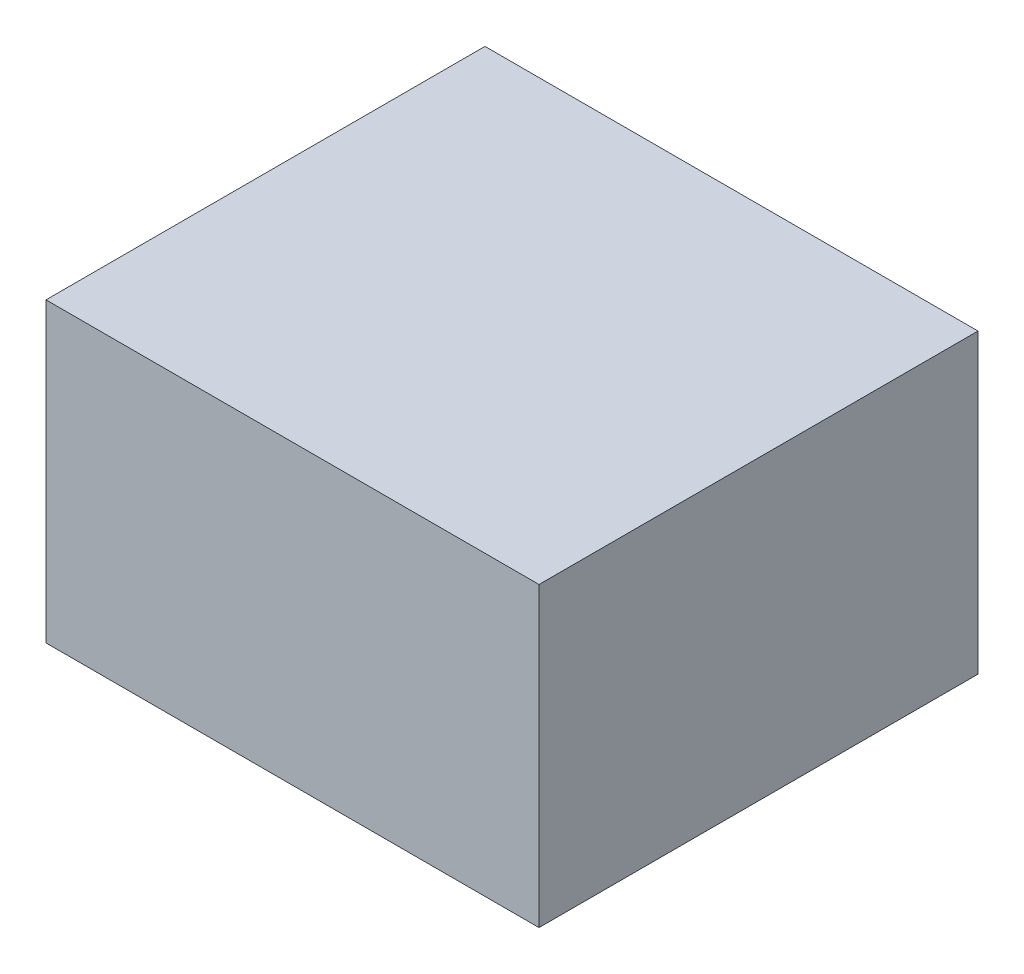
ISO-10303-21;
HEADER;
FILE_DESCRIPTION(('STEP AP214'),'2;1');
FILE_NAME('part.step','',(''),(''),'','','');
FILE_SCHEMA(('AUTOMOTIVE_DESIGN { 1 0 10303 214 1 1 1 1 }'));
ENDSEC;
DATA;
#1=APPLICATION_CONTEXT('core data for automotive mechanical design processes');
#2=APPLICATION_PROTOCOL_DEFINITION('international standard','automotive_design',2000,#1);
#3=PRODUCT_CONTEXT('',#1,'mechanical');
#4=PRODUCT('Part','Part','',(#3));
#5=PRODUCT_RELATED_PRODUCT_CATEGORY('part','',(#4));
#6=PRODUCT_DEFINITION_FORMATION('','',#4);
#7=PRODUCT_DEFINITION_CONTEXT('part definition',#1,'design');
#8=PRODUCT_DEFINITION('design','',#6,#7);
#9=PRODUCT_DEFINITION_SHAPE('','',#8);
#10=(LENGTH_UNIT() NAMED_UNIT(*) SI_UNIT(.MILLI.,.METRE.));
#11=(NAMED_UNIT(*) PLANE_ANGLE_UNIT() SI_UNIT($,.RADIAN.));
#12=(NAMED_UNIT(*) SI_UNIT($,.STERADIAN.) SOLID_ANGLE_UNIT());
#13=UNCERTAINTY_MEASURE_WITH_UNIT(LENGTH_MEASURE(1.E-05),#10,'distance_accuracy_value','');
#14=(GEOMETRIC_REPRESENTATION_CONTEXT(3) GLOBAL_UNCERTAINTY_ASSIGNED_CONTEXT((#13)) GLOBAL_UNIT_ASSIGNED_CONTEXT((#10,
#11,#12)) REPRESENTATION_CONTEXT('',''));
#15=CARTESIAN_POINT('',(0.,0.,0.));
#16=DIRECTION('',(0.,0.,1.));
#17=DIRECTION('',(1.,0.,0.));
#18=AXIS2_PLACEMENT_3D('',#15,#16,#17);
#19=CARTESIAN_POINT('',(36.5,44.,-32.5));
#20=DIRECTION('',(-1.,0.,0.));
#21=DIRECTION('',(0.,0.,1.));
#22=AXIS2_PLACEMENT_3D('',#19,#20,#21);
#23=PLANE('',#22);
#24=DIRECTION('',(0.,0.,-1.));
#25=VECTOR('',#24,1.);
#26=CARTESIAN_POINT('',(36.5,0.,-32.5));
#27=LINE('',#26,#25);
#28=CARTESIAN_POINT('',(36.5,0.,32.5));
#29=VERTEX_POINT('',#28);
#30=CARTESIAN_POINT('',(36.5,0.,-32.5));
#31=VERTEX_POINT('',#30);
#32=EDGE_CURVE('E104',#29,#31,#27,.T.);
#33=ORIENTED_EDGE('',*,*,#32,.T.);
#34=DIRECTION('',(0.,-1.,0.));
#35=VECTOR('',#34,1.);
#36=CARTESIAN_POINT('',(36.5,44.,-32.5));
#37=LINE('',#36,#35);
#38=CARTESIAN_POINT('',(36.5,44.,-32.5));
#39=VERTEX_POINT('',#38);
#40=EDGE_CURVE('E11',#39,#31,#37,.T.);
#41=ORIENTED_EDGE('',*,*,#40,.F.);
#42=DIRECTION('',(0.,0.,-1.));
#43=VECTOR('',#42,1.);
#44=CARTESIAN_POINT('',(36.5,44.,-32.5));
#45=LINE('',#44,#43);
#46=CARTESIAN_POINT('',(36.5,44.,32.5));
#47=VERTEX_POINT('',#46);
#48=EDGE_CURVE('E92',#47,#39,#45,.T.);
#49=ORIENTED_EDGE('',*,*,#48,.F.);
#50=DIRECTION('',(0.,-1.,0.));
#51=VECTOR('',#50,1.);
#52=CARTESIAN_POINT('',(36.5,44.,32.5));
#53=LINE('',#52,#51);
#54=EDGE_CURVE('E100',#47,#29,#53,.T.);
#55=ORIENTED_EDGE('',*,*,#54,.T.);
#56=EDGE_LOOP('',(#33,#41,#49,#55));
#57=FACE_BOUND('',#56,.T.);
#58=ADVANCED_FACE('F41',(#57),#23,.F.);
#59=CARTESIAN_POINT('',(-36.5,44.,-32.5));
#60=DIRECTION('',(0.,0.,1.));
#61=DIRECTION('',(1.,0.,0.));
#62=AXIS2_PLACEMENT_3D('',#59,#60,#61);
#63=PLANE('',#62);
#64=DIRECTION('',(-1.,0.,0.));
#65=VECTOR('',#64,1.);
#66=CARTESIAN_POINT('',(-36.5,0.,-32.5));
#67=LINE('',#66,#65);
#68=CARTESIAN_POINT('',(-36.5,0.,-32.5));
#69=VERTEX_POINT('',#68);
#70=EDGE_CURVE('E96',#31,#69,#67,.T.);
#71=ORIENTED_EDGE('',*,*,#70,.T.);
#72=DIRECTION('',(0.,-1.,0.));
#73=VECTOR('',#72,1.);
#74=CARTESIAN_POINT('',(-36.5,44.,-32.5));
#75=LINE('',#74,#73);
#76=CARTESIAN_POINT('',(-36.5,44.,-32.5));
#77=VERTEX_POINT('',#76);
#78=EDGE_CURVE('E49',#77,#69,#75,.T.);
#79=ORIENTED_EDGE('',*,*,#78,.F.);
#80=DIRECTION('',(-1.,0.,0.));
#81=VECTOR('',#80,1.);
#82=CARTESIAN_POINT('',(-36.5,44.,-32.5));
#83=LINE('',#82,#81);
#84=EDGE_CURVE('E87',#39,#77,#83,.T.);
#85=ORIENTED_EDGE('',*,*,#84,.F.);
#86=ORIENTED_EDGE('',*,*,#40,.T.);
#87=EDGE_LOOP('',(#71,#79,#85,#86));
#88=FACE_BOUND('',#87,.T.);
#89=ADVANCED_FACE('F95',(#88),#63,.F.);
#90=CARTESIAN_POINT('',(-36.5,44.,-32.5));
#91=DIRECTION('',(1.,0.,0.));
#92=DIRECTION('',(0.,0.,-1.));
#93=AXIS2_PLACEMENT_3D('',#90,#91,#92);
#94=PLANE('',#93);
#95=DIRECTION('',(0.,0.,1.));
#96=VECTOR('',#95,1.);
#97=CARTESIAN_POINT('',(-36.5,0.,-32.5));
#98=LINE('',#97,#96);
#99=CARTESIAN_POINT('',(-36.5,0.,32.5));
#100=VERTEX_POINT('',#99);
#101=EDGE_CURVE('E74',#69,#100,#98,.T.);
#102=ORIENTED_EDGE('',*,*,#101,.T.);
#103=DIRECTION('',(0.,-1.,0.));
#104=VECTOR('',#103,1.);
#105=CARTESIAN_POINT('',(-36.5,44.,32.5));
#106=LINE('',#105,#104);
#107=CARTESIAN_POINT('',(-36.5,44.,32.5));
#108=VERTEX_POINT('',#107);
#109=EDGE_CURVE('E97',#108,#100,#106,.T.);
#110=ORIENTED_EDGE('',*,*,#109,.F.);
#111=DIRECTION('',(0.,0.,1.));
#112=VECTOR('',#111,1.);
#113=CARTESIAN_POINT('',(-36.5,44.,-32.5));
#114=LINE('',#113,#112);
#115=EDGE_CURVE('E90',#77,#108,#114,.T.);
#116=ORIENTED_EDGE('',*,*,#115,.F.);
#117=ORIENTED_EDGE('',*,*,#78,.T.);
#118=EDGE_LOOP('',(#102,#110,#116,#117));
#119=FACE_BOUND('',#118,.T.);
#120=ADVANCED_FACE('F98',(#119),#94,.F.);
#121=CARTESIAN_POINT('',(-36.5,44.,32.5));
#122=DIRECTION('',(0.,0.,-1.));
#123=DIRECTION('',(-1.,0.,0.));
#124=AXIS2_PLACEMENT_3D('',#121,#122,#123);
#125=PLANE('',#124);
#126=DIRECTION('',(1.,0.,0.));
#127=VECTOR('',#126,1.);
#128=CARTESIAN_POINT('',(-36.5,0.,32.5));
#129=LINE('',#128,#127);
#130=EDGE_CURVE('E80',#100,#29,#129,.T.);
#131=ORIENTED_EDGE('',*,*,#130,.T.);
#132=ORIENTED_EDGE('',*,*,#54,.F.);
#133=DIRECTION('',(1.,0.,0.));
#134=VECTOR('',#133,1.);
#135=CARTESIAN_POINT('',(-36.5,44.,32.5));
#136=LINE('',#135,#134);
#137=EDGE_CURVE('E57',#108,#47,#136,.T.);
#138=ORIENTED_EDGE('',*,*,#137,.F.);
#139=ORIENTED_EDGE('',*,*,#109,.T.);
#140=EDGE_LOOP('',(#131,#132,#138,#139));
#141=FACE_BOUND('',#140,.T.);
#142=ADVANCED_FACE('F111',(#141),#125,.F.);
#143=CARTESIAN_POINT('',(0.,44.,0.));
#144=DIRECTION('',(0.,1.,0.));
#145=DIRECTION('',(0.,0.,1.));
#146=AXIS2_PLACEMENT_3D('',#143,#144,#145);
#147=PLANE('',#146);
#148=ORIENTED_EDGE('',*,*,#48,.T.);
#149=ORIENTED_EDGE('',*,*,#84,.T.);
#150=ORIENTED_EDGE('',*,*,#115,.T.);
#151=ORIENTED_EDGE('',*,*,#137,.T.);
#152=EDGE_LOOP('',(#148,#149,#150,#151));
#153=FACE_BOUND('',#152,.T.);
#154=ADVANCED_FACE('F88',(#153),#147,.T.);
#155=CARTESIAN_POINT('',(0.,0.,0.));
#156=DIRECTION('',(0.,1.,0.));
#157=DIRECTION('',(0.,0.,1.));
#158=AXIS2_PLACEMENT_3D('',#155,#156,#157);
#159=PLANE('',#158);
#160=ORIENTED_EDGE('',*,*,#32,.F.);
#161=ORIENTED_EDGE('',*,*,#130,.F.);
#162=ORIENTED_EDGE('',*,*,#101,.F.);
#163=ORIENTED_EDGE('',*,*,#70,.F.);
#164=EDGE_LOOP('',(#160,#161,#162,#163));
#165=FACE_BOUND('',#164,.T.);
#166=ADVANCED_FACE('F114',(#165),#159,.F.);
#167=CLOSED_SHELL('',(#58,#89,#120,#142,#154,#166));
#168=MANIFOLD_SOLID_BREP('B2',#167);
#169=ADVANCED_BREP_SHAPE_REPRESENTATION('',(#18,#168),#14);
#170=SHAPE_DEFINITION_REPRESENTATION(#9,#169);
ENDSEC;
END-ISO-10303-21;
